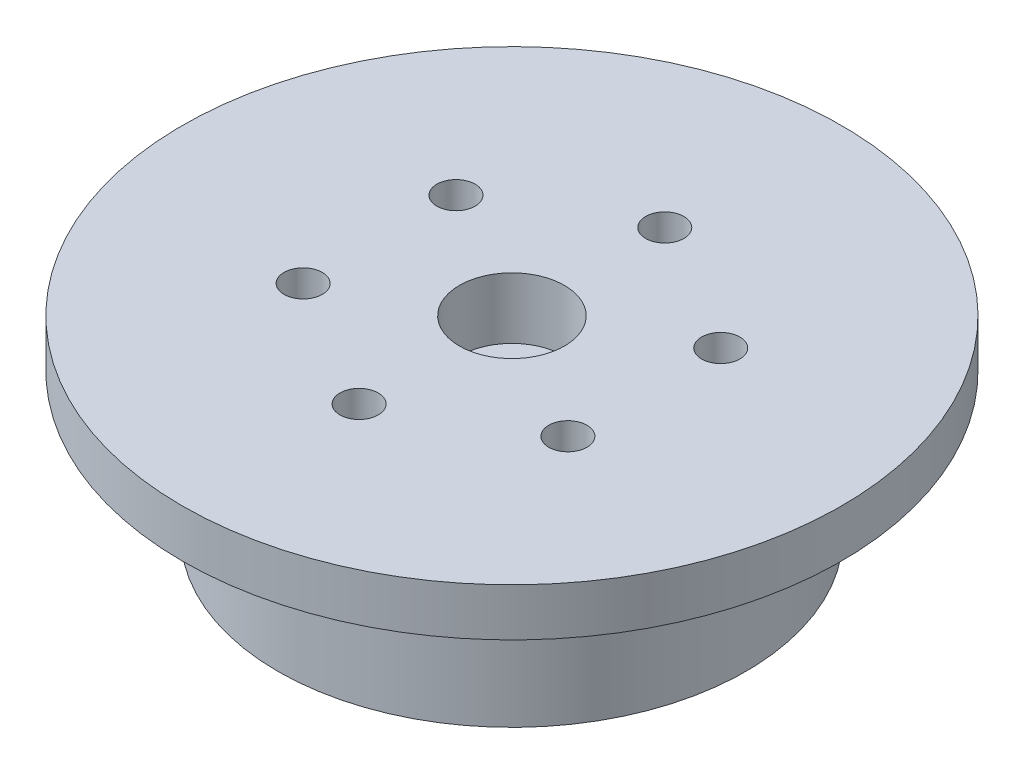
ISO-10303-21;
HEADER;
FILE_DESCRIPTION(('STEP AP214'),'2;1');
FILE_NAME('part.step','',(''),(''),'','','');
FILE_SCHEMA(('AUTOMOTIVE_DESIGN { 1 0 10303 214 1 1 1 1 }'));
ENDSEC;
DATA;
#1=APPLICATION_CONTEXT('core data for automotive mechanical design processes');
#2=APPLICATION_PROTOCOL_DEFINITION('international standard','automotive_design',2000,#1);
#3=PRODUCT_CONTEXT('',#1,'mechanical');
#4=PRODUCT('Part','Part','',(#3));
#5=PRODUCT_RELATED_PRODUCT_CATEGORY('part','',(#4));
#6=PRODUCT_DEFINITION_FORMATION('','',#4);
#7=PRODUCT_DEFINITION_CONTEXT('part definition',#1,'design');
#8=PRODUCT_DEFINITION('design','',#6,#7);
#9=PRODUCT_DEFINITION_SHAPE('','',#8);
#10=(LENGTH_UNIT() NAMED_UNIT(*) SI_UNIT(.MILLI.,.METRE.));
#11=(NAMED_UNIT(*) PLANE_ANGLE_UNIT() SI_UNIT($,.RADIAN.));
#12=(NAMED_UNIT(*) SI_UNIT($,.STERADIAN.) SOLID_ANGLE_UNIT());
#13=UNCERTAINTY_MEASURE_WITH_UNIT(LENGTH_MEASURE(1.E-05),#10,'distance_accuracy_value','');
#14=(GEOMETRIC_REPRESENTATION_CONTEXT(3) GLOBAL_UNCERTAINTY_ASSIGNED_CONTEXT((#13)) GLOBAL_UNIT_ASSIGNED_CONTEXT((#10,
#11,#12)) REPRESENTATION_CONTEXT('',''));
#15=CARTESIAN_POINT('',(0.,0.,0.));
#16=DIRECTION('',(0.,0.,1.));
#17=DIRECTION('',(1.,0.,0.));
#18=AXIS2_PLACEMENT_3D('',#15,#16,#17);
#19=CARTESIAN_POINT('',(0.,5.,0.));
#20=DIRECTION('',(0.,-1.,0.));
#21=DIRECTION('',(0.,0.,-1.));
#22=AXIS2_PLACEMENT_3D('',#19,#20,#21);
#23=CYLINDRICAL_SURFACE('',#22,34.5);
#24=CARTESIAN_POINT('',(0.,5.,0.));
#25=DIRECTION('',(0.,1.,0.));
#26=DIRECTION('',(0.,0.,1.));
#27=AXIS2_PLACEMENT_3D('',#24,#25,#26);
#28=CIRCLE('',#27,34.5);
#29=CARTESIAN_POINT('',(0.,5.,34.5));
#30=VERTEX_POINT('',#29);
#31=EDGE_CURVE('E197',#30,#30,#28,.T.);
#32=ORIENTED_EDGE('',*,*,#31,.F.);
#33=EDGE_LOOP('',(#32));
#34=FACE_BOUND('',#33,.T.);
#35=CARTESIAN_POINT('',(0.,0.,0.));
#36=DIRECTION('',(0.,1.,0.));
#37=DIRECTION('',(0.,0.,1.));
#38=AXIS2_PLACEMENT_3D('',#35,#36,#37);
#39=CIRCLE('',#38,34.5);
#40=CARTESIAN_POINT('',(0.,0.,34.5));
#41=VERTEX_POINT('',#40);
#42=EDGE_CURVE('E193',#41,#41,#39,.T.);
#43=ORIENTED_EDGE('',*,*,#42,.T.);
#44=EDGE_LOOP('',(#43));
#45=FACE_BOUND('',#44,.T.);
#46=ADVANCED_FACE('F51',(#34,#45),#23,.T.);
#47=CARTESIAN_POINT('',(0.,5.,0.));
#48=DIRECTION('',(0.,1.,0.));
#49=DIRECTION('',(0.,0.,1.));
#50=AXIS2_PLACEMENT_3D('',#47,#48,#49);
#51=PLANE('',#50);
#52=CARTESIAN_POINT('',(0.,5.,0.));
#53=DIRECTION('',(0.,1.,0.));
#54=DIRECTION('',(0.,0.,1.));
#55=AXIS2_PLACEMENT_3D('',#52,#53,#54);
#56=CIRCLE('',#55,5.5);
#57=CARTESIAN_POINT('',(0.,5.,5.5));
#58=VERTEX_POINT('',#57);
#59=EDGE_CURVE('E538',#58,#58,#56,.T.);
#60=ORIENTED_EDGE('',*,*,#59,.F.);
#61=EDGE_LOOP('',(#60));
#62=FACE_BOUND('',#61,.T.);
#63=CARTESIAN_POINT('',(13.8564064605509,5.,-8.00000000000016));
#64=DIRECTION('',(0.,1.,0.));
#65=DIRECTION('',(-0.866025403784433,0.,0.50000000000001));
#66=AXIS2_PLACEMENT_3D('',#63,#64,#65);
#67=CIRCLE('',#66,2.);
#68=CARTESIAN_POINT('',(12.1243556529821,5.,-7.00000000000014));
#69=VERTEX_POINT('',#68);
#70=EDGE_CURVE('E138',#69,#69,#67,.T.);
#71=ORIENTED_EDGE('',*,*,#70,.F.);
#72=EDGE_LOOP('',(#71));
#73=FACE_BOUND('',#72,.T.);
#74=CARTESIAN_POINT('',(13.8564064605511,5.,7.99999999999987));
#75=DIRECTION('',(0.,1.,0.));
#76=DIRECTION('',(-0.866025403784443,0.,-0.499999999999992));
#77=AXIS2_PLACEMENT_3D('',#74,#75,#76);
#78=CIRCLE('',#77,2.);
#79=CARTESIAN_POINT('',(12.1243556529822,5.,6.99999999999989));
#80=VERTEX_POINT('',#79);
#81=EDGE_CURVE('E157',#80,#80,#78,.T.);
#82=ORIENTED_EDGE('',*,*,#81,.F.);
#83=EDGE_LOOP('',(#82));
#84=FACE_BOUND('',#83,.T.);
#85=CARTESIAN_POINT('',(0.,5.,16.));
#86=DIRECTION('',(0.,1.,0.));
#87=DIRECTION('',(0.,0.,-1.));
#88=AXIS2_PLACEMENT_3D('',#85,#86,#87);
#89=CIRCLE('',#88,2.);
#90=CARTESIAN_POINT('',(0.,5.,14.));
#91=VERTEX_POINT('',#90);
#92=EDGE_CURVE('E149',#91,#91,#89,.T.);
#93=ORIENTED_EDGE('',*,*,#92,.F.);
#94=EDGE_LOOP('',(#93));
#95=FACE_BOUND('',#94,.T.);
#96=CARTESIAN_POINT('',(-13.856406460551,5.,8.00000000000007));
#97=DIRECTION('',(0.,1.,0.));
#98=DIRECTION('',(0.866025403784436,0.,-0.500000000000004));
#99=AXIS2_PLACEMENT_3D('',#96,#97,#98);
#100=CIRCLE('',#99,2.);
#101=CARTESIAN_POINT('',(-12.1243556529821,5.,7.00000000000006));
#102=VERTEX_POINT('',#101);
#103=EDGE_CURVE('E139',#102,#102,#100,.T.);
#104=ORIENTED_EDGE('',*,*,#103,.F.);
#105=EDGE_LOOP('',(#104));
#106=FACE_BOUND('',#105,.T.);
#107=CARTESIAN_POINT('',(-13.856406460551,5.,-7.99999999999997));
#108=DIRECTION('',(0.,1.,0.));
#109=DIRECTION('',(0.86602540378444,0.,0.499999999999998));
#110=AXIS2_PLACEMENT_3D('',#107,#108,#109);
#111=CIRCLE('',#110,2.);
#112=CARTESIAN_POINT('',(-12.1243556529822,5.,-6.99999999999997));
#113=VERTEX_POINT('',#112);
#114=EDGE_CURVE('E148',#113,#113,#111,.T.);
#115=ORIENTED_EDGE('',*,*,#114,.F.);
#116=EDGE_LOOP('',(#115));
#117=FACE_BOUND('',#116,.T.);
#118=CARTESIAN_POINT('',(0.,5.,-16.));
#119=DIRECTION('',(0.,1.,0.));
#120=DIRECTION('',(0.,0.,1.));
#121=AXIS2_PLACEMENT_3D('',#118,#119,#120);
#122=CIRCLE('',#121,2.);
#123=CARTESIAN_POINT('',(0.,5.,-14.));
#124=VERTEX_POINT('',#123);
#125=EDGE_CURVE('E178',#124,#124,#122,.T.);
#126=ORIENTED_EDGE('',*,*,#125,.F.);
#127=EDGE_LOOP('',(#126));
#128=FACE_BOUND('',#127,.T.);
#129=ORIENTED_EDGE('',*,*,#31,.T.);
#130=EDGE_LOOP('',(#129));
#131=FACE_BOUND('',#130,.T.);
#132=ADVANCED_FACE('F209',(#62,#73,#84,#95,#106,#117,#128,#131),#51,.T.);
#133=CARTESIAN_POINT('',(0.,0.,0.));
#134=DIRECTION('',(0.,1.,0.));
#135=DIRECTION('',(0.,0.,1.));
#136=AXIS2_PLACEMENT_3D('',#133,#134,#135);
#137=PLANE('',#136);
#138=CARTESIAN_POINT('',(0.,0.,0.));
#139=DIRECTION('',(0.,-1.,0.));
#140=DIRECTION('',(0.,0.,-1.));
#141=AXIS2_PLACEMENT_3D('',#138,#139,#140);
#142=CIRCLE('',#141,24.5);
#143=CARTESIAN_POINT('',(0.,0.,-24.5));
#144=VERTEX_POINT('',#143);
#145=EDGE_CURVE('E189',#144,#144,#142,.T.);
#146=ORIENTED_EDGE('',*,*,#145,.F.);
#147=EDGE_LOOP('',(#146));
#148=FACE_BOUND('',#147,.T.);
#149=ORIENTED_EDGE('',*,*,#42,.F.);
#150=EDGE_LOOP('',(#149));
#151=FACE_BOUND('',#150,.T.);
#152=ADVANCED_FACE('F206',(#148,#151),#137,.F.);
#153=CARTESIAN_POINT('',(0.,-15.,0.));
#154=DIRECTION('',(0.,1.,0.));
#155=DIRECTION('',(0.,0.,1.));
#156=AXIS2_PLACEMENT_3D('',#153,#154,#155);
#157=CYLINDRICAL_SURFACE('',#156,24.5);
#158=CARTESIAN_POINT('',(0.,-15.,0.));
#159=DIRECTION('',(0.,-1.,0.));
#160=DIRECTION('',(0.,0.,-1.));
#161=AXIS2_PLACEMENT_3D('',#158,#159,#160);
#162=CIRCLE('',#161,24.5);
#163=CARTESIAN_POINT('',(0.,-15.,-24.5));
#164=VERTEX_POINT('',#163);
#165=EDGE_CURVE('E183',#164,#164,#162,.T.);
#166=ORIENTED_EDGE('',*,*,#165,.F.);
#167=EDGE_LOOP('',(#166));
#168=FACE_BOUND('',#167,.T.);
#169=ORIENTED_EDGE('',*,*,#145,.T.);
#170=EDGE_LOOP('',(#169));
#171=FACE_BOUND('',#170,.T.);
#172=ADVANCED_FACE('F208',(#168,#171),#157,.T.);
#173=CARTESIAN_POINT('',(0.,-15.,0.));
#174=DIRECTION('',(0.,-1.,0.));
#175=DIRECTION('',(0.,0.,-1.));
#176=AXIS2_PLACEMENT_3D('',#173,#174,#175);
#177=PLANE('',#176);
#178=DIRECTION('',(-1.,0.,0.));
#179=VECTOR('',#178,1.);
#180=CARTESIAN_POINT('',(0.,-15.,2.5));
#181=LINE('',#180,#179);
#182=CARTESIAN_POINT('',(-6.37749950999606,-15.,2.5));
#183=VERTEX_POINT('',#182);
#184=CARTESIAN_POINT('',(-9.35,-15.,2.5));
#185=VERTEX_POINT('',#184);
#186=EDGE_CURVE('E75',#183,#185,#181,.T.);
#187=ORIENTED_EDGE('',*,*,#186,.F.);
#188=CARTESIAN_POINT('',(0.,-15.,0.));
#189=DIRECTION('',(0.,-1.,0.));
#190=DIRECTION('',(0.,0.,-1.));
#191=AXIS2_PLACEMENT_3D('',#188,#189,#190);
#192=CIRCLE('',#191,6.85);
#193=CARTESIAN_POINT('',(-6.37749950999606,-15.,-2.5));
#194=VERTEX_POINT('',#193);
#195=EDGE_CURVE('E60',#194,#183,#192,.T.);
#196=ORIENTED_EDGE('',*,*,#195,.F.);
#197=DIRECTION('',(1.,0.,0.));
#198=VECTOR('',#197,1.);
#199=CARTESIAN_POINT('',(0.,-15.,-2.5));
#200=LINE('',#199,#198);
#201=CARTESIAN_POINT('',(-9.35,-15.,-2.5));
#202=VERTEX_POINT('',#201);
#203=EDGE_CURVE('E133',#202,#194,#200,.T.);
#204=ORIENTED_EDGE('',*,*,#203,.F.);
#205=DIRECTION('',(0.,0.,-1.));
#206=VECTOR('',#205,1.);
#207=CARTESIAN_POINT('',(-9.35,-15.,0.));
#208=LINE('',#207,#206);
#209=EDGE_CURVE('E12',#185,#202,#208,.T.);
#210=ORIENTED_EDGE('',*,*,#209,.F.);
#211=EDGE_LOOP('',(#187,#196,#204,#210));
#212=FACE_BOUND('',#211,.T.);
#213=ORIENTED_EDGE('',*,*,#165,.T.);
#214=EDGE_LOOP('',(#213));
#215=FACE_BOUND('',#214,.T.);
#216=ADVANCED_FACE('F215',(#212,#215),#177,.T.);
#217=CARTESIAN_POINT('',(0.,-5.,-16.));
#218=DIRECTION('',(0.,1.,0.));
#219=DIRECTION('',(0.,0.,1.));
#220=AXIS2_PLACEMENT_3D('',#217,#218,#219);
#221=CYLINDRICAL_SURFACE('',#220,2.);
#222=CARTESIAN_POINT('',(0.,-5.,-16.));
#223=DIRECTION('',(0.,1.,0.));
#224=DIRECTION('',(0.,0.,1.));
#225=AXIS2_PLACEMENT_3D('',#222,#223,#224);
#226=CIRCLE('',#225,2.);
#227=CARTESIAN_POINT('',(0.,-5.,-14.));
#228=VERTEX_POINT('',#227);
#229=EDGE_CURVE('E179',#228,#228,#226,.T.);
#230=ORIENTED_EDGE('',*,*,#229,.F.);
#231=EDGE_LOOP('',(#230));
#232=FACE_BOUND('',#231,.T.);
#233=ORIENTED_EDGE('',*,*,#125,.T.);
#234=EDGE_LOOP('',(#233));
#235=FACE_BOUND('',#234,.T.);
#236=ADVANCED_FACE('F427',(#232,#235),#221,.F.);
#237=CARTESIAN_POINT('',(0.,-5.,-16.));
#238=DIRECTION('',(0.,1.,0.));
#239=DIRECTION('',(0.,0.,1.));
#240=AXIS2_PLACEMENT_3D('',#237,#238,#239);
#241=PLANE('',#240);
#242=ORIENTED_EDGE('',*,*,#229,.T.);
#243=EDGE_LOOP('',(#242));
#244=FACE_BOUND('',#243,.T.);
#245=ADVANCED_FACE('F341',(#244),#241,.T.);
#246=CARTESIAN_POINT('',(-13.856406460551,-5.,-7.99999999999997));
#247=DIRECTION('',(0.,1.,0.));
#248=DIRECTION('',(0.86602540378444,0.,0.499999999999998));
#249=AXIS2_PLACEMENT_3D('',#246,#247,#248);
#250=CYLINDRICAL_SURFACE('',#249,2.);
#251=CARTESIAN_POINT('',(-13.856406460551,-5.,-7.99999999999997));
#252=DIRECTION('',(0.,1.,0.));
#253=DIRECTION('',(0.86602540378444,0.,0.499999999999998));
#254=AXIS2_PLACEMENT_3D('',#251,#252,#253);
#255=CIRCLE('',#254,2.);
#256=CARTESIAN_POINT('',(-12.1243556529822,-5.,-6.99999999999997));
#257=VERTEX_POINT('',#256);
#258=EDGE_CURVE('E174',#257,#257,#255,.T.);
#259=ORIENTED_EDGE('',*,*,#258,.F.);
#260=EDGE_LOOP('',(#259));
#261=FACE_BOUND('',#260,.T.);
#262=ORIENTED_EDGE('',*,*,#114,.T.);
#263=EDGE_LOOP('',(#262));
#264=FACE_BOUND('',#263,.T.);
#265=ADVANCED_FACE('F330',(#261,#264),#250,.F.);
#266=CARTESIAN_POINT('',(-13.856406460551,-5.,-7.99999999999997));
#267=DIRECTION('',(0.,1.,0.));
#268=DIRECTION('',(0.86602540378444,0.,0.499999999999998));
#269=AXIS2_PLACEMENT_3D('',#266,#267,#268);
#270=PLANE('',#269);
#271=ORIENTED_EDGE('',*,*,#258,.T.);
#272=EDGE_LOOP('',(#271));
#273=FACE_BOUND('',#272,.T.);
#274=ADVANCED_FACE('F324',(#273),#270,.T.);
#275=CARTESIAN_POINT('',(-13.856406460551,-5.,8.00000000000007));
#276=DIRECTION('',(0.,1.,0.));
#277=DIRECTION('',(0.866025403784436,0.,-0.500000000000004));
#278=AXIS2_PLACEMENT_3D('',#275,#276,#277);
#279=CYLINDRICAL_SURFACE('',#278,2.);
#280=CARTESIAN_POINT('',(-13.856406460551,-5.,8.00000000000007));
#281=DIRECTION('',(0.,1.,0.));
#282=DIRECTION('',(0.866025403784436,0.,-0.500000000000004));
#283=AXIS2_PLACEMENT_3D('',#280,#281,#282);
#284=CIRCLE('',#283,2.);
#285=CARTESIAN_POINT('',(-12.1243556529821,-5.,7.00000000000006));
#286=VERTEX_POINT('',#285);
#287=EDGE_CURVE('E143',#286,#286,#284,.T.);
#288=ORIENTED_EDGE('',*,*,#287,.F.);
#289=EDGE_LOOP('',(#288));
#290=FACE_BOUND('',#289,.T.);
#291=ORIENTED_EDGE('',*,*,#103,.T.);
#292=EDGE_LOOP('',(#291));
#293=FACE_BOUND('',#292,.T.);
#294=ADVANCED_FACE('F329',(#290,#293),#279,.F.);
#295=CARTESIAN_POINT('',(-13.856406460551,-5.,8.00000000000007));
#296=DIRECTION('',(0.,1.,0.));
#297=DIRECTION('',(0.866025403784436,0.,-0.500000000000004));
#298=AXIS2_PLACEMENT_3D('',#295,#296,#297);
#299=PLANE('',#298);
#300=ORIENTED_EDGE('',*,*,#287,.T.);
#301=EDGE_LOOP('',(#300));
#302=FACE_BOUND('',#301,.T.);
#303=ADVANCED_FACE('F348',(#302),#299,.T.);
#304=CARTESIAN_POINT('',(0.,-5.,16.));
#305=DIRECTION('',(0.,1.,0.));
#306=DIRECTION('',(0.,0.,-1.));
#307=AXIS2_PLACEMENT_3D('',#304,#305,#306);
#308=CYLINDRICAL_SURFACE('',#307,2.);
#309=CARTESIAN_POINT('',(0.,-5.,16.));
#310=DIRECTION('',(0.,1.,0.));
#311=DIRECTION('',(0.,0.,-1.));
#312=AXIS2_PLACEMENT_3D('',#309,#310,#311);
#313=CIRCLE('',#312,2.);
#314=CARTESIAN_POINT('',(0.,-5.,14.));
#315=VERTEX_POINT('',#314);
#316=EDGE_CURVE('E144',#315,#315,#313,.T.);
#317=ORIENTED_EDGE('',*,*,#316,.F.);
#318=EDGE_LOOP('',(#317));
#319=FACE_BOUND('',#318,.T.);
#320=ORIENTED_EDGE('',*,*,#92,.T.);
#321=EDGE_LOOP('',(#320));
#322=FACE_BOUND('',#321,.T.);
#323=ADVANCED_FACE('F353',(#319,#322),#308,.F.);
#324=CARTESIAN_POINT('',(0.,-5.,16.));
#325=DIRECTION('',(0.,1.,0.));
#326=DIRECTION('',(0.,0.,-1.));
#327=AXIS2_PLACEMENT_3D('',#324,#325,#326);
#328=PLANE('',#327);
#329=ORIENTED_EDGE('',*,*,#316,.T.);
#330=EDGE_LOOP('',(#329));
#331=FACE_BOUND('',#330,.T.);
#332=ADVANCED_FACE('F368',(#331),#328,.T.);
#333=CARTESIAN_POINT('',(13.8564064605511,-5.,7.99999999999987));
#334=DIRECTION('',(0.,1.,0.));
#335=DIRECTION('',(-0.866025403784443,0.,-0.499999999999992));
#336=AXIS2_PLACEMENT_3D('',#333,#334,#335);
#337=CYLINDRICAL_SURFACE('',#336,2.);
#338=CARTESIAN_POINT('',(13.8564064605511,-5.,7.99999999999987));
#339=DIRECTION('',(0.,1.,0.));
#340=DIRECTION('',(-0.866025403784443,0.,-0.499999999999992));
#341=AXIS2_PLACEMENT_3D('',#338,#339,#340);
#342=CIRCLE('',#341,2.);
#343=CARTESIAN_POINT('',(12.1243556529822,-5.,6.99999999999989));
#344=VERTEX_POINT('',#343);
#345=EDGE_CURVE('E153',#344,#344,#342,.T.);
#346=ORIENTED_EDGE('',*,*,#345,.F.);
#347=EDGE_LOOP('',(#346));
#348=FACE_BOUND('',#347,.T.);
#349=ORIENTED_EDGE('',*,*,#81,.T.);
#350=EDGE_LOOP('',(#349));
#351=FACE_BOUND('',#350,.T.);
#352=ADVANCED_FACE('F373',(#348,#351),#337,.F.);
#353=CARTESIAN_POINT('',(13.8564064605511,-5.,7.99999999999987));
#354=DIRECTION('',(0.,1.,0.));
#355=DIRECTION('',(-0.866025403784443,0.,-0.499999999999992));
#356=AXIS2_PLACEMENT_3D('',#353,#354,#355);
#357=PLANE('',#356);
#358=ORIENTED_EDGE('',*,*,#345,.T.);
#359=EDGE_LOOP('',(#358));
#360=FACE_BOUND('',#359,.T.);
#361=ADVANCED_FACE('F388',(#360),#357,.T.);
#362=CARTESIAN_POINT('',(13.8564064605509,-5.,-8.00000000000016));
#363=DIRECTION('',(0.,1.,0.));
#364=DIRECTION('',(-0.866025403784433,0.,0.50000000000001));
#365=AXIS2_PLACEMENT_3D('',#362,#363,#364);
#366=CYLINDRICAL_SURFACE('',#365,2.);
#367=CARTESIAN_POINT('',(13.8564064605509,-5.,-8.00000000000016));
#368=DIRECTION('',(0.,1.,0.));
#369=DIRECTION('',(-0.866025403784433,0.,0.50000000000001));
#370=AXIS2_PLACEMENT_3D('',#367,#368,#369);
#371=CIRCLE('',#370,2.);
#372=CARTESIAN_POINT('',(12.1243556529821,-5.,-7.00000000000014));
#373=VERTEX_POINT('',#372);
#374=EDGE_CURVE('E161',#373,#373,#371,.T.);
#375=ORIENTED_EDGE('',*,*,#374,.F.);
#376=EDGE_LOOP('',(#375));
#377=FACE_BOUND('',#376,.T.);
#378=ORIENTED_EDGE('',*,*,#70,.T.);
#379=EDGE_LOOP('',(#378));
#380=FACE_BOUND('',#379,.T.);
#381=ADVANCED_FACE('F393',(#377,#380),#366,.F.);
#382=CARTESIAN_POINT('',(13.8564064605509,-5.,-8.00000000000016));
#383=DIRECTION('',(0.,1.,0.));
#384=DIRECTION('',(-0.866025403784433,0.,0.50000000000001));
#385=AXIS2_PLACEMENT_3D('',#382,#383,#384);
#386=PLANE('',#385);
#387=ORIENTED_EDGE('',*,*,#374,.T.);
#388=EDGE_LOOP('',(#387));
#389=FACE_BOUND('',#388,.T.);
#390=ADVANCED_FACE('F248',(#389),#386,.T.);
#391=CARTESIAN_POINT('',(0.,-5.,0.));
#392=DIRECTION('',(0.,1.,0.));
#393=DIRECTION('',(0.,0.,1.));
#394=AXIS2_PLACEMENT_3D('',#391,#392,#393);
#395=PLANE('',#394);
#396=CARTESIAN_POINT('',(0.,-5.,0.));
#397=DIRECTION('',(0.,1.,0.));
#398=DIRECTION('',(0.,0.,1.));
#399=AXIS2_PLACEMENT_3D('',#396,#397,#398);
#400=CIRCLE('',#399,3.3);
#401=CARTESIAN_POINT('',(0.,-5.,3.3));
#402=VERTEX_POINT('',#401);
#403=EDGE_CURVE('E54',#402,#402,#400,.T.);
#404=ORIENTED_EDGE('',*,*,#403,.T.);
#405=EDGE_LOOP('',(#404));
#406=FACE_BOUND('',#405,.T.);
#407=CARTESIAN_POINT('',(0.,-5.,0.));
#408=DIRECTION('',(0.,1.,0.));
#409=DIRECTION('',(0.,0.,1.));
#410=AXIS2_PLACEMENT_3D('',#407,#408,#409);
#411=CIRCLE('',#410,6.85);
#412=CARTESIAN_POINT('',(-6.37749950999606,-5.,-2.5));
#413=VERTEX_POINT('',#412);
#414=CARTESIAN_POINT('',(-6.37749950999606,-5.,2.5));
#415=VERTEX_POINT('',#414);
#416=EDGE_CURVE('E111',#413,#415,#411,.F.);
#417=ORIENTED_EDGE('',*,*,#416,.T.);
#418=DIRECTION('',(-1.,0.,0.));
#419=VECTOR('',#418,1.);
#420=CARTESIAN_POINT('',(-9.35,-5.,2.5));
#421=LINE('',#420,#419);
#422=CARTESIAN_POINT('',(-9.35,-5.,2.5));
#423=VERTEX_POINT('',#422);
#424=EDGE_CURVE('E106',#415,#423,#421,.T.);
#425=ORIENTED_EDGE('',*,*,#424,.T.);
#426=DIRECTION('',(0.,0.,-1.));
#427=VECTOR('',#426,1.);
#428=CARTESIAN_POINT('',(-9.35,-5.,-2.5));
#429=LINE('',#428,#427);
#430=CARTESIAN_POINT('',(-9.35,-5.,-2.5));
#431=VERTEX_POINT('',#430);
#432=EDGE_CURVE('E94',#423,#431,#429,.T.);
#433=ORIENTED_EDGE('',*,*,#432,.T.);
#434=DIRECTION('',(1.,0.,0.));
#435=VECTOR('',#434,1.);
#436=CARTESIAN_POINT('',(-6.37749950999606,-5.,-2.5));
#437=LINE('',#436,#435);
#438=EDGE_CURVE('E124',#431,#413,#437,.T.);
#439=ORIENTED_EDGE('',*,*,#438,.T.);
#440=EDGE_LOOP('',(#417,#425,#433,#439));
#441=FACE_BOUND('',#440,.T.);
#442=ADVANCED_FACE('F110',(#406,#441),#395,.F.);
#443=CARTESIAN_POINT('',(-9.35,26.2162673437153,2.5));
#444=DIRECTION('',(0.,0.,1.));
#445=DIRECTION('',(1.,0.,0.));
#446=AXIS2_PLACEMENT_3D('',#443,#444,#445);
#447=PLANE('',#446);
#448=ORIENTED_EDGE('',*,*,#186,.T.);
#449=DIRECTION('',(0.,-1.,0.));
#450=VECTOR('',#449,1.);
#451=CARTESIAN_POINT('',(-9.35,26.2162673437153,2.5));
#452=LINE('',#451,#450);
#453=EDGE_CURVE('E96',#423,#185,#452,.T.);
#454=ORIENTED_EDGE('',*,*,#453,.F.);
#455=ORIENTED_EDGE('',*,*,#424,.F.);
#456=DIRECTION('',(0.,-1.,0.));
#457=VECTOR('',#456,1.);
#458=CARTESIAN_POINT('',(-6.37749950999606,26.2162673437153,2.5));
#459=LINE('',#458,#457);
#460=EDGE_CURVE('E123',#415,#183,#459,.T.);
#461=ORIENTED_EDGE('',*,*,#460,.T.);
#462=EDGE_LOOP('',(#448,#454,#455,#461));
#463=FACE_BOUND('',#462,.T.);
#464=ADVANCED_FACE('F105',(#463),#447,.F.);
#465=CARTESIAN_POINT('',(-9.35,26.2162673437153,-2.5));
#466=DIRECTION('',(-1.,0.,0.));
#467=DIRECTION('',(0.,0.,1.));
#468=AXIS2_PLACEMENT_3D('',#465,#466,#467);
#469=PLANE('',#468);
#470=ORIENTED_EDGE('',*,*,#209,.T.);
#471=DIRECTION('',(0.,-1.,0.));
#472=VECTOR('',#471,1.);
#473=CARTESIAN_POINT('',(-9.35,26.2162673437153,-2.5));
#474=LINE('',#473,#472);
#475=EDGE_CURVE('E99',#431,#202,#474,.T.);
#476=ORIENTED_EDGE('',*,*,#475,.F.);
#477=ORIENTED_EDGE('',*,*,#432,.F.);
#478=ORIENTED_EDGE('',*,*,#453,.T.);
#479=EDGE_LOOP('',(#470,#476,#477,#478));
#480=FACE_BOUND('',#479,.T.);
#481=ADVANCED_FACE('F95',(#480),#469,.F.);
#482=CARTESIAN_POINT('',(-6.37749950999606,26.2162673437153,-2.5));
#483=DIRECTION('',(0.,0.,-1.));
#484=DIRECTION('',(-1.,0.,0.));
#485=AXIS2_PLACEMENT_3D('',#482,#483,#484);
#486=PLANE('',#485);
#487=ORIENTED_EDGE('',*,*,#203,.T.);
#488=DIRECTION('',(0.,-1.,0.));
#489=VECTOR('',#488,1.);
#490=CARTESIAN_POINT('',(-6.37749950999606,26.2162673437153,-2.5));
#491=LINE('',#490,#489);
#492=EDGE_CURVE('E67',#413,#194,#491,.T.);
#493=ORIENTED_EDGE('',*,*,#492,.F.);
#494=ORIENTED_EDGE('',*,*,#438,.F.);
#495=ORIENTED_EDGE('',*,*,#475,.T.);
#496=EDGE_LOOP('',(#487,#493,#494,#495));
#497=FACE_BOUND('',#496,.T.);
#498=ADVANCED_FACE('F297',(#497),#486,.F.);
#499=CARTESIAN_POINT('',(0.,26.2162673437153,0.));
#500=DIRECTION('',(0.,-1.,0.));
#501=DIRECTION('',(0.,0.,-1.));
#502=AXIS2_PLACEMENT_3D('',#499,#500,#501);
#503=CYLINDRICAL_SURFACE('',#502,6.85);
#504=ORIENTED_EDGE('',*,*,#195,.T.);
#505=ORIENTED_EDGE('',*,*,#460,.F.);
#506=ORIENTED_EDGE('',*,*,#416,.F.);
#507=ORIENTED_EDGE('',*,*,#492,.T.);
#508=EDGE_LOOP('',(#504,#505,#506,#507));
#509=FACE_BOUND('',#508,.T.);
#510=ADVANCED_FACE('F239',(#509),#503,.F.);
#511=CARTESIAN_POINT('',(0.,5.,0.));
#512=DIRECTION('',(0.,1.,0.));
#513=DIRECTION('',(0.,0.,1.));
#514=AXIS2_PLACEMENT_3D('',#511,#512,#513);
#515=CYLINDRICAL_SURFACE('',#514,3.3);
#516=CARTESIAN_POINT('',(0.,-1.4,0.));
#517=DIRECTION('',(0.,1.,0.));
#518=DIRECTION('',(0.,0.,1.));
#519=AXIS2_PLACEMENT_3D('',#516,#517,#518);
#520=CIRCLE('',#519,3.3);
#521=CARTESIAN_POINT('',(0.,-1.4,3.3));
#522=VERTEX_POINT('',#521);
#523=EDGE_CURVE('E117',#522,#522,#520,.T.);
#524=ORIENTED_EDGE('',*,*,#523,.T.);
#525=EDGE_LOOP('',(#524));
#526=FACE_BOUND('',#525,.T.);
#527=ORIENTED_EDGE('',*,*,#403,.F.);
#528=EDGE_LOOP('',(#527));
#529=FACE_BOUND('',#528,.T.);
#530=ADVANCED_FACE('F259',(#526,#529),#515,.F.);
#531=CARTESIAN_POINT('',(3.3,-1.4,0.));
#532=DIRECTION('',(0.,-1.,0.));
#533=DIRECTION('',(0.,0.,-1.));
#534=AXIS2_PLACEMENT_3D('',#531,#532,#533);
#535=PLANE('',#534);
#536=ORIENTED_EDGE('',*,*,#523,.F.);
#537=EDGE_LOOP('',(#536));
#538=FACE_BOUND('',#537,.T.);
#539=CARTESIAN_POINT('',(0.,-1.4,0.));
#540=DIRECTION('',(0.,1.,0.));
#541=DIRECTION('',(0.,0.,1.));
#542=AXIS2_PLACEMENT_3D('',#539,#540,#541);
#543=CIRCLE('',#542,5.5);
#544=CARTESIAN_POINT('',(0.,-1.4,5.5));
#545=VERTEX_POINT('',#544);
#546=EDGE_CURVE('E535',#545,#545,#543,.T.);
#547=ORIENTED_EDGE('',*,*,#546,.T.);
#548=EDGE_LOOP('',(#547));
#549=FACE_BOUND('',#548,.T.);
#550=ADVANCED_FACE('F264',(#538,#549),#535,.F.);
#551=CARTESIAN_POINT('',(0.,5.,0.));
#552=DIRECTION('',(0.,1.,0.));
#553=DIRECTION('',(0.,0.,1.));
#554=AXIS2_PLACEMENT_3D('',#551,#552,#553);
#555=CYLINDRICAL_SURFACE('',#554,5.5);
#556=ORIENTED_EDGE('',*,*,#546,.F.);
#557=EDGE_LOOP('',(#556));
#558=FACE_BOUND('',#557,.T.);
#559=ORIENTED_EDGE('',*,*,#59,.T.);
#560=EDGE_LOOP('',(#559));
#561=FACE_BOUND('',#560,.T.);
#562=ADVANCED_FACE('F275',(#558,#561),#555,.F.);
#563=CLOSED_SHELL('',(#46,#132,#152,#172,#216,#236,#245,#265,#274,#294,#303,#323,#332,#352,#361,
#381,#390,#442,#464,#481,#498,#510,#530,#550,#562));
#564=MANIFOLD_SOLID_BREP('B2',#563);
#565=ADVANCED_BREP_SHAPE_REPRESENTATION('',(#18,#564),#14);
#566=SHAPE_DEFINITION_REPRESENTATION(#9,#565);
ENDSEC;
END-ISO-10303-21;
